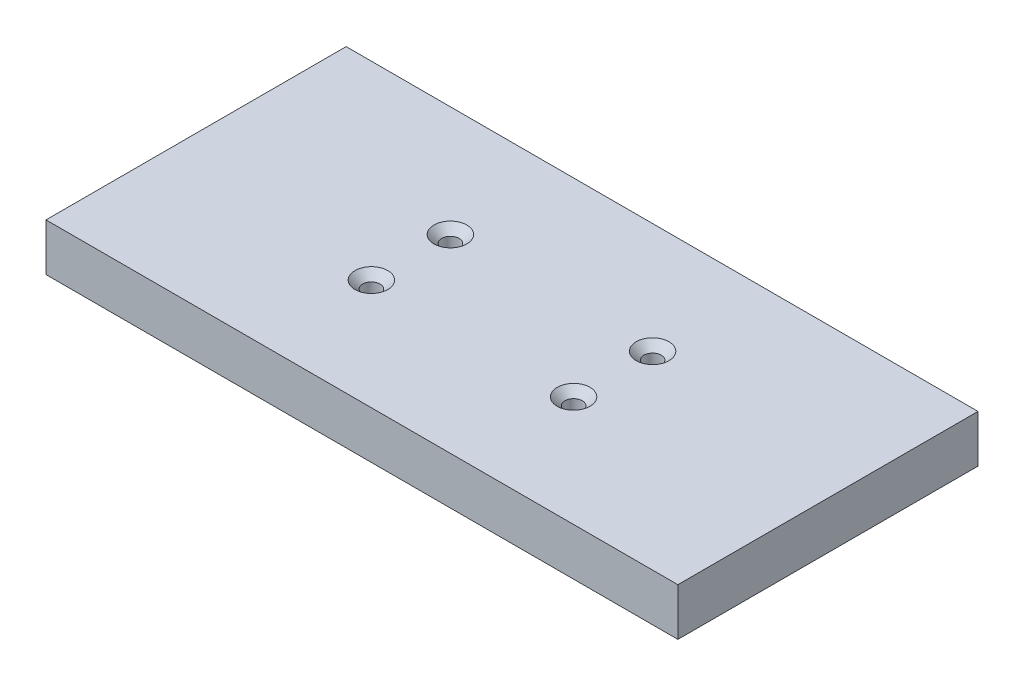
ISO-10303-21;
HEADER;
FILE_DESCRIPTION(('STEP AP214'),'2;1');
FILE_NAME('part.step','',(''),(''),'','','');
FILE_SCHEMA(('AUTOMOTIVE_DESIGN { 1 0 10303 214 1 1 1 1 }'));
ENDSEC;
DATA;
#1=APPLICATION_CONTEXT('core data for automotive mechanical design processes');
#2=APPLICATION_PROTOCOL_DEFINITION('international standard','automotive_design',2000,#1);
#3=PRODUCT_CONTEXT('',#1,'mechanical');
#4=PRODUCT('Part','Part','',(#3));
#5=PRODUCT_RELATED_PRODUCT_CATEGORY('part','',(#4));
#6=PRODUCT_DEFINITION_FORMATION('','',#4);
#7=PRODUCT_DEFINITION_CONTEXT('part definition',#1,'design');
#8=PRODUCT_DEFINITION('design','',#6,#7);
#9=PRODUCT_DEFINITION_SHAPE('','',#8);
#10=(LENGTH_UNIT() NAMED_UNIT(*) SI_UNIT(.MILLI.,.METRE.));
#11=(NAMED_UNIT(*) PLANE_ANGLE_UNIT() SI_UNIT($,.RADIAN.));
#12=(NAMED_UNIT(*) SI_UNIT($,.STERADIAN.) SOLID_ANGLE_UNIT());
#13=UNCERTAINTY_MEASURE_WITH_UNIT(LENGTH_MEASURE(1.E-05),#10,'distance_accuracy_value','');
#14=(GEOMETRIC_REPRESENTATION_CONTEXT(3) GLOBAL_UNCERTAINTY_ASSIGNED_CONTEXT((#13)) GLOBAL_UNIT_ASSIGNED_CONTEXT((#10,
#11,#12)) REPRESENTATION_CONTEXT('',''));
#15=CARTESIAN_POINT('',(0.,0.,0.));
#16=DIRECTION('',(0.,0.,1.));
#17=DIRECTION('',(1.,0.,0.));
#18=AXIS2_PLACEMENT_3D('',#15,#16,#17);
#19=CARTESIAN_POINT('',(100.,15.,47.5));
#20=DIRECTION('',(-1.,0.,0.));
#21=DIRECTION('',(0.,0.,1.));
#22=AXIS2_PLACEMENT_3D('',#19,#20,#21);
#23=PLANE('',#22);
#24=DIRECTION('',(0.,0.,-1.));
#25=VECTOR('',#24,1.);
#26=CARTESIAN_POINT('',(100.,0.,47.5));
#27=LINE('',#26,#25);
#28=CARTESIAN_POINT('',(100.,0.,47.5));
#29=VERTEX_POINT('',#28);
#30=CARTESIAN_POINT('',(100.,0.,-47.5));
#31=VERTEX_POINT('',#30);
#32=EDGE_CURVE('E98',#29,#31,#27,.T.);
#33=ORIENTED_EDGE('',*,*,#32,.T.);
#34=DIRECTION('',(0.,-1.,0.));
#35=VECTOR('',#34,1.);
#36=CARTESIAN_POINT('',(100.,15.,-47.5));
#37=LINE('',#36,#35);
#38=CARTESIAN_POINT('',(100.,15.,-47.5));
#39=VERTEX_POINT('',#38);
#40=EDGE_CURVE('E11',#39,#31,#37,.T.);
#41=ORIENTED_EDGE('',*,*,#40,.F.);
#42=DIRECTION('',(0.,0.,-1.));
#43=VECTOR('',#42,1.);
#44=CARTESIAN_POINT('',(100.,15.,47.5));
#45=LINE('',#44,#43);
#46=CARTESIAN_POINT('',(100.,15.,47.5));
#47=VERTEX_POINT('',#46);
#48=EDGE_CURVE('E86',#47,#39,#45,.T.);
#49=ORIENTED_EDGE('',*,*,#48,.F.);
#50=DIRECTION('',(0.,-1.,0.));
#51=VECTOR('',#50,1.);
#52=CARTESIAN_POINT('',(100.,15.,47.5));
#53=LINE('',#52,#51);
#54=EDGE_CURVE('E94',#47,#29,#53,.T.);
#55=ORIENTED_EDGE('',*,*,#54,.T.);
#56=EDGE_LOOP('',(#33,#41,#49,#55));
#57=FACE_BOUND('',#56,.T.);
#58=ADVANCED_FACE('F35',(#57),#23,.F.);
#59=CARTESIAN_POINT('',(-100.,15.,-47.5));
#60=DIRECTION('',(0.,0.,1.));
#61=DIRECTION('',(1.,0.,0.));
#62=AXIS2_PLACEMENT_3D('',#59,#60,#61);
#63=PLANE('',#62);
#64=DIRECTION('',(-1.,0.,0.));
#65=VECTOR('',#64,1.);
#66=CARTESIAN_POINT('',(-100.,0.,-47.5));
#67=LINE('',#66,#65);
#68=CARTESIAN_POINT('',(-100.,0.,-47.5));
#69=VERTEX_POINT('',#68);
#70=EDGE_CURVE('E90',#31,#69,#67,.T.);
#71=ORIENTED_EDGE('',*,*,#70,.T.);
#72=DIRECTION('',(0.,-1.,0.));
#73=VECTOR('',#72,1.);
#74=CARTESIAN_POINT('',(-100.,15.,-47.5));
#75=LINE('',#74,#73);
#76=CARTESIAN_POINT('',(-100.,15.,-47.5));
#77=VERTEX_POINT('',#76);
#78=EDGE_CURVE('E43',#77,#69,#75,.T.);
#79=ORIENTED_EDGE('',*,*,#78,.F.);
#80=DIRECTION('',(-1.,0.,0.));
#81=VECTOR('',#80,1.);
#82=CARTESIAN_POINT('',(-100.,15.,-47.5));
#83=LINE('',#82,#81);
#84=EDGE_CURVE('E81',#39,#77,#83,.T.);
#85=ORIENTED_EDGE('',*,*,#84,.F.);
#86=ORIENTED_EDGE('',*,*,#40,.T.);
#87=EDGE_LOOP('',(#71,#79,#85,#86));
#88=FACE_BOUND('',#87,.T.);
#89=ADVANCED_FACE('F89',(#88),#63,.F.);
#90=CARTESIAN_POINT('',(-100.,15.,47.5));
#91=DIRECTION('',(1.,0.,0.));
#92=DIRECTION('',(0.,0.,-1.));
#93=AXIS2_PLACEMENT_3D('',#90,#91,#92);
#94=PLANE('',#93);
#95=DIRECTION('',(0.,0.,1.));
#96=VECTOR('',#95,1.);
#97=CARTESIAN_POINT('',(-100.,0.,47.5));
#98=LINE('',#97,#96);
#99=CARTESIAN_POINT('',(-100.,0.,47.5));
#100=VERTEX_POINT('',#99);
#101=EDGE_CURVE('E68',#69,#100,#98,.T.);
#102=ORIENTED_EDGE('',*,*,#101,.T.);
#103=DIRECTION('',(0.,-1.,0.));
#104=VECTOR('',#103,1.);
#105=CARTESIAN_POINT('',(-100.,15.,47.5));
#106=LINE('',#105,#104);
#107=CARTESIAN_POINT('',(-100.,15.,47.5));
#108=VERTEX_POINT('',#107);
#109=EDGE_CURVE('E91',#108,#100,#106,.T.);
#110=ORIENTED_EDGE('',*,*,#109,.F.);
#111=DIRECTION('',(0.,0.,1.));
#112=VECTOR('',#111,1.);
#113=CARTESIAN_POINT('',(-100.,15.,47.5));
#114=LINE('',#113,#112);
#115=EDGE_CURVE('E84',#77,#108,#114,.T.);
#116=ORIENTED_EDGE('',*,*,#115,.F.);
#117=ORIENTED_EDGE('',*,*,#78,.T.);
#118=EDGE_LOOP('',(#102,#110,#116,#117));
#119=FACE_BOUND('',#118,.T.);
#120=ADVANCED_FACE('F92',(#119),#94,.F.);
#121=CARTESIAN_POINT('',(-100.,15.,47.5));
#122=DIRECTION('',(0.,0.,-1.));
#123=DIRECTION('',(-1.,0.,0.));
#124=AXIS2_PLACEMENT_3D('',#121,#122,#123);
#125=PLANE('',#124);
#126=DIRECTION('',(1.,0.,0.));
#127=VECTOR('',#126,1.);
#128=CARTESIAN_POINT('',(-100.,0.,47.5));
#129=LINE('',#128,#127);
#130=EDGE_CURVE('E74',#100,#29,#129,.T.);
#131=ORIENTED_EDGE('',*,*,#130,.T.);
#132=ORIENTED_EDGE('',*,*,#54,.F.);
#133=DIRECTION('',(1.,0.,0.));
#134=VECTOR('',#133,1.);
#135=CARTESIAN_POINT('',(-100.,15.,47.5));
#136=LINE('',#135,#134);
#137=EDGE_CURVE('E51',#108,#47,#136,.T.);
#138=ORIENTED_EDGE('',*,*,#137,.F.);
#139=ORIENTED_EDGE('',*,*,#109,.T.);
#140=EDGE_LOOP('',(#131,#132,#138,#139));
#141=FACE_BOUND('',#140,.T.);
#142=ADVANCED_FACE('F106',(#141),#125,.F.);
#143=CARTESIAN_POINT('',(0.,15.,0.));
#144=DIRECTION('',(0.,-1.,0.));
#145=DIRECTION('',(0.,0.,-1.));
#146=AXIS2_PLACEMENT_3D('',#143,#144,#145);
#147=PLANE('',#146);
#148=CARTESIAN_POINT('',(32.,15.,-12.5));
#149=DIRECTION('',(0.,1.,0.));
#150=DIRECTION('',(0.,0.,1.));
#151=AXIS2_PLACEMENT_3D('',#148,#149,#150);
#152=CIRCLE('',#151,5.2);
#153=CARTESIAN_POINT('',(32.,15.,-7.3));
#154=VERTEX_POINT('',#153);
#155=EDGE_CURVE('E144',#154,#154,#152,.T.);
#156=ORIENTED_EDGE('',*,*,#155,.F.);
#157=EDGE_LOOP('',(#156));
#158=FACE_BOUND('',#157,.T.);
#159=CARTESIAN_POINT('',(32.,15.,12.5));
#160=DIRECTION('',(0.,1.,0.));
#161=DIRECTION('',(0.,0.,1.));
#162=AXIS2_PLACEMENT_3D('',#159,#160,#161);
#163=CIRCLE('',#162,5.2);
#164=CARTESIAN_POINT('',(32.,15.,17.7));
#165=VERTEX_POINT('',#164);
#166=EDGE_CURVE('E135',#165,#165,#163,.T.);
#167=ORIENTED_EDGE('',*,*,#166,.F.);
#168=EDGE_LOOP('',(#167));
#169=FACE_BOUND('',#168,.T.);
#170=CARTESIAN_POINT('',(-32.,15.,12.5));
#171=DIRECTION('',(0.,1.,0.));
#172=DIRECTION('',(0.,0.,1.));
#173=AXIS2_PLACEMENT_3D('',#170,#171,#172);
#174=CIRCLE('',#173,5.2);
#175=CARTESIAN_POINT('',(-32.,15.,17.7));
#176=VERTEX_POINT('',#175);
#177=EDGE_CURVE('E126',#176,#176,#174,.T.);
#178=ORIENTED_EDGE('',*,*,#177,.F.);
#179=EDGE_LOOP('',(#178));
#180=FACE_BOUND('',#179,.T.);
#181=CARTESIAN_POINT('',(-32.,15.,-12.5));
#182=DIRECTION('',(0.,1.,0.));
#183=DIRECTION('',(0.,0.,1.));
#184=AXIS2_PLACEMENT_3D('',#181,#182,#183);
#185=CIRCLE('',#184,5.2);
#186=CARTESIAN_POINT('',(-32.,15.,-7.3));
#187=VERTEX_POINT('',#186);
#188=EDGE_CURVE('E117',#187,#187,#185,.T.);
#189=ORIENTED_EDGE('',*,*,#188,.F.);
#190=EDGE_LOOP('',(#189));
#191=FACE_BOUND('',#190,.T.);
#192=ORIENTED_EDGE('',*,*,#48,.T.);
#193=ORIENTED_EDGE('',*,*,#84,.T.);
#194=ORIENTED_EDGE('',*,*,#115,.T.);
#195=ORIENTED_EDGE('',*,*,#137,.T.);
#196=EDGE_LOOP('',(#192,#193,#194,#195));
#197=FACE_BOUND('',#196,.T.);
#198=ADVANCED_FACE('F82',(#158,#169,#180,#191,#197),#147,.F.);
#199=CARTESIAN_POINT('',(0.,0.,0.));
#200=DIRECTION('',(0.,-1.,0.));
#201=DIRECTION('',(0.,0.,-1.));
#202=AXIS2_PLACEMENT_3D('',#199,#200,#201);
#203=PLANE('',#202);
#204=CARTESIAN_POINT('',(32.,0.,-12.5));
#205=DIRECTION('',(0.,1.,0.));
#206=DIRECTION('',(0.,0.,1.));
#207=AXIS2_PLACEMENT_3D('',#204,#205,#206);
#208=CIRCLE('',#207,2.75);
#209=CARTESIAN_POINT('',(32.,0.,-9.75000000000001));
#210=VERTEX_POINT('',#209);
#211=EDGE_CURVE('E138',#210,#210,#208,.T.);
#212=ORIENTED_EDGE('',*,*,#211,.T.);
#213=EDGE_LOOP('',(#212));
#214=FACE_BOUND('',#213,.T.);
#215=CARTESIAN_POINT('',(32.,0.,12.5));
#216=DIRECTION('',(0.,1.,0.));
#217=DIRECTION('',(0.,0.,1.));
#218=AXIS2_PLACEMENT_3D('',#215,#216,#217);
#219=CIRCLE('',#218,2.75);
#220=CARTESIAN_POINT('',(32.,0.,15.25));
#221=VERTEX_POINT('',#220);
#222=EDGE_CURVE('E129',#221,#221,#219,.T.);
#223=ORIENTED_EDGE('',*,*,#222,.T.);
#224=EDGE_LOOP('',(#223));
#225=FACE_BOUND('',#224,.T.);
#226=CARTESIAN_POINT('',(-32.,0.,12.5));
#227=DIRECTION('',(0.,1.,0.));
#228=DIRECTION('',(0.,0.,1.));
#229=AXIS2_PLACEMENT_3D('',#226,#227,#228);
#230=CIRCLE('',#229,2.75);
#231=CARTESIAN_POINT('',(-32.,0.,15.25));
#232=VERTEX_POINT('',#231);
#233=EDGE_CURVE('E120',#232,#232,#230,.T.);
#234=ORIENTED_EDGE('',*,*,#233,.T.);
#235=EDGE_LOOP('',(#234));
#236=FACE_BOUND('',#235,.T.);
#237=CARTESIAN_POINT('',(-32.,0.,-12.5));
#238=DIRECTION('',(0.,1.,0.));
#239=DIRECTION('',(0.,0.,1.));
#240=AXIS2_PLACEMENT_3D('',#237,#238,#239);
#241=CIRCLE('',#240,2.75);
#242=CARTESIAN_POINT('',(-32.,0.,-9.75000000000001));
#243=VERTEX_POINT('',#242);
#244=EDGE_CURVE('E101',#243,#243,#241,.T.);
#245=ORIENTED_EDGE('',*,*,#244,.T.);
#246=EDGE_LOOP('',(#245));
#247=FACE_BOUND('',#246,.T.);
#248=ORIENTED_EDGE('',*,*,#32,.F.);
#249=ORIENTED_EDGE('',*,*,#130,.F.);
#250=ORIENTED_EDGE('',*,*,#101,.F.);
#251=ORIENTED_EDGE('',*,*,#70,.F.);
#252=EDGE_LOOP('',(#248,#249,#250,#251));
#253=FACE_BOUND('',#252,.T.);
#254=ADVANCED_FACE('F109',(#214,#225,#236,#247,#253),#203,.T.);
#255=CARTESIAN_POINT('',(-32.,15.,-12.5));
#256=DIRECTION('',(0.,1.,0.));
#257=DIRECTION('',(0.,0.,1.));
#258=AXIS2_PLACEMENT_3D('',#255,#256,#257);
#259=CYLINDRICAL_SURFACE('',#258,2.75);
#260=ORIENTED_EDGE('',*,*,#244,.F.);
#261=EDGE_LOOP('',(#260));
#262=FACE_BOUND('',#261,.T.);
#263=CARTESIAN_POINT('',(-32.,12.55,-12.5));
#264=DIRECTION('',(0.,1.,0.));
#265=DIRECTION('',(0.,0.,1.));
#266=AXIS2_PLACEMENT_3D('',#263,#264,#265);
#267=CIRCLE('',#266,2.75);
#268=CARTESIAN_POINT('',(-32.,12.55,-9.75000000000001));
#269=VERTEX_POINT('',#268);
#270=EDGE_CURVE('E114',#269,#269,#267,.T.);
#271=ORIENTED_EDGE('',*,*,#270,.T.);
#272=EDGE_LOOP('',(#271));
#273=FACE_BOUND('',#272,.T.);
#274=ADVANCED_FACE('F162',(#262,#273),#259,.F.);
#275=CARTESIAN_POINT('',(-32.,15.,-12.5));
#276=DIRECTION('',(0.,1.,0.));
#277=DIRECTION('',(0.,0.,1.));
#278=AXIS2_PLACEMENT_3D('',#275,#276,#277);
#279=CONICAL_SURFACE('',#278,5.2,0.785398163397449);
#280=ORIENTED_EDGE('',*,*,#270,.F.);
#281=EDGE_LOOP('',(#280));
#282=FACE_BOUND('',#281,.T.);
#283=ORIENTED_EDGE('',*,*,#188,.T.);
#284=EDGE_LOOP('',(#283));
#285=FACE_BOUND('',#284,.T.);
#286=ADVANCED_FACE('F159',(#282,#285),#279,.F.);
#287=CARTESIAN_POINT('',(-32.,15.,12.5));
#288=DIRECTION('',(0.,1.,0.));
#289=DIRECTION('',(0.,0.,1.));
#290=AXIS2_PLACEMENT_3D('',#287,#288,#289);
#291=CYLINDRICAL_SURFACE('',#290,2.75);
#292=ORIENTED_EDGE('',*,*,#233,.F.);
#293=EDGE_LOOP('',(#292));
#294=FACE_BOUND('',#293,.T.);
#295=CARTESIAN_POINT('',(-32.,12.55,12.5));
#296=DIRECTION('',(0.,1.,0.));
#297=DIRECTION('',(0.,0.,1.));
#298=AXIS2_PLACEMENT_3D('',#295,#296,#297);
#299=CIRCLE('',#298,2.75);
#300=CARTESIAN_POINT('',(-32.,12.55,15.25));
#301=VERTEX_POINT('',#300);
#302=EDGE_CURVE('E123',#301,#301,#299,.T.);
#303=ORIENTED_EDGE('',*,*,#302,.T.);
#304=EDGE_LOOP('',(#303));
#305=FACE_BOUND('',#304,.T.);
#306=ADVANCED_FACE('F161',(#294,#305),#291,.F.);
#307=CARTESIAN_POINT('',(-32.,15.,12.5));
#308=DIRECTION('',(0.,1.,0.));
#309=DIRECTION('',(0.,0.,1.));
#310=AXIS2_PLACEMENT_3D('',#307,#308,#309);
#311=CONICAL_SURFACE('',#310,5.2,0.785398163397449);
#312=ORIENTED_EDGE('',*,*,#302,.F.);
#313=EDGE_LOOP('',(#312));
#314=FACE_BOUND('',#313,.T.);
#315=ORIENTED_EDGE('',*,*,#177,.T.);
#316=EDGE_LOOP('',(#315));
#317=FACE_BOUND('',#316,.T.);
#318=ADVANCED_FACE('F169',(#314,#317),#311,.F.);
#319=CARTESIAN_POINT('',(32.,15.,12.5));
#320=DIRECTION('',(0.,1.,0.));
#321=DIRECTION('',(0.,0.,1.));
#322=AXIS2_PLACEMENT_3D('',#319,#320,#321);
#323=CYLINDRICAL_SURFACE('',#322,2.75);
#324=ORIENTED_EDGE('',*,*,#222,.F.);
#325=EDGE_LOOP('',(#324));
#326=FACE_BOUND('',#325,.T.);
#327=CARTESIAN_POINT('',(32.,12.55,12.5));
#328=DIRECTION('',(0.,1.,0.));
#329=DIRECTION('',(0.,0.,1.));
#330=AXIS2_PLACEMENT_3D('',#327,#328,#329);
#331=CIRCLE('',#330,2.75);
#332=CARTESIAN_POINT('',(32.,12.55,15.25));
#333=VERTEX_POINT('',#332);
#334=EDGE_CURVE('E132',#333,#333,#331,.T.);
#335=ORIENTED_EDGE('',*,*,#334,.T.);
#336=EDGE_LOOP('',(#335));
#337=FACE_BOUND('',#336,.T.);
#338=ADVANCED_FACE('F203',(#326,#337),#323,.F.);
#339=CARTESIAN_POINT('',(32.,15.,12.5));
#340=DIRECTION('',(0.,1.,0.));
#341=DIRECTION('',(0.,0.,1.));
#342=AXIS2_PLACEMENT_3D('',#339,#340,#341);
#343=CONICAL_SURFACE('',#342,5.2,0.78539816339745);
#344=ORIENTED_EDGE('',*,*,#334,.F.);
#345=EDGE_LOOP('',(#344));
#346=FACE_BOUND('',#345,.T.);
#347=ORIENTED_EDGE('',*,*,#166,.T.);
#348=EDGE_LOOP('',(#347));
#349=FACE_BOUND('',#348,.T.);
#350=ADVANCED_FACE('F208',(#346,#349),#343,.F.);
#351=CARTESIAN_POINT('',(32.,15.,-12.5));
#352=DIRECTION('',(0.,1.,0.));
#353=DIRECTION('',(0.,0.,1.));
#354=AXIS2_PLACEMENT_3D('',#351,#352,#353);
#355=CYLINDRICAL_SURFACE('',#354,2.75);
#356=ORIENTED_EDGE('',*,*,#211,.F.);
#357=EDGE_LOOP('',(#356));
#358=FACE_BOUND('',#357,.T.);
#359=CARTESIAN_POINT('',(32.,12.55,-12.5));
#360=DIRECTION('',(0.,1.,0.));
#361=DIRECTION('',(0.,0.,1.));
#362=AXIS2_PLACEMENT_3D('',#359,#360,#361);
#363=CIRCLE('',#362,2.75);
#364=CARTESIAN_POINT('',(32.,12.55,-9.75000000000001));
#365=VERTEX_POINT('',#364);
#366=EDGE_CURVE('E141',#365,#365,#363,.T.);
#367=ORIENTED_EDGE('',*,*,#366,.T.);
#368=EDGE_LOOP('',(#367));
#369=FACE_BOUND('',#368,.T.);
#370=ADVANCED_FACE('F214',(#358,#369),#355,.F.);
#371=CARTESIAN_POINT('',(32.,15.,-12.5));
#372=DIRECTION('',(0.,1.,0.));
#373=DIRECTION('',(0.,0.,1.));
#374=AXIS2_PLACEMENT_3D('',#371,#372,#373);
#375=CONICAL_SURFACE('',#374,5.2,0.78539816339745);
#376=ORIENTED_EDGE('',*,*,#366,.F.);
#377=EDGE_LOOP('',(#376));
#378=FACE_BOUND('',#377,.T.);
#379=ORIENTED_EDGE('',*,*,#155,.T.);
#380=EDGE_LOOP('',(#379));
#381=FACE_BOUND('',#380,.T.);
#382=ADVANCED_FACE('F148',(#378,#381),#375,.F.);
#383=CLOSED_SHELL('',(#58,#89,#120,#142,#198,#254,#274,#286,#306,#318,#338,#350,#370,#382));
#384=MANIFOLD_SOLID_BREP('B2',#383);
#385=ADVANCED_BREP_SHAPE_REPRESENTATION('',(#18,#384),#14);
#386=SHAPE_DEFINITION_REPRESENTATION(#9,#385);
ENDSEC;
END-ISO-10303-21;
